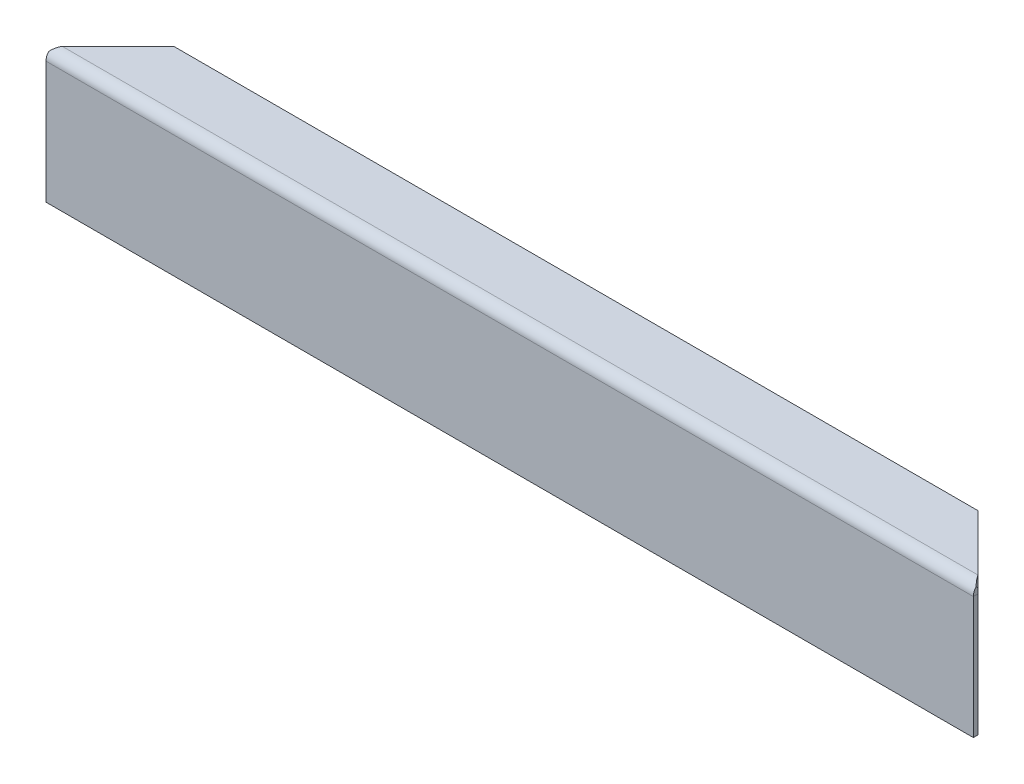
ISO-10303-21;
HEADER;
FILE_DESCRIPTION(('STEP AP214'),'2;1');
FILE_NAME('part.step','',(''),(''),'','','');
FILE_SCHEMA(('AUTOMOTIVE_DESIGN { 1 0 10303 214 1 1 1 1 }'));
ENDSEC;
DATA;
#1=APPLICATION_CONTEXT('core data for automotive mechanical design processes');
#2=APPLICATION_PROTOCOL_DEFINITION('international standard','automotive_design',2000,#1);
#3=PRODUCT_CONTEXT('',#1,'mechanical');
#4=PRODUCT('Part','Part','',(#3));
#5=PRODUCT_RELATED_PRODUCT_CATEGORY('part','',(#4));
#6=PRODUCT_DEFINITION_FORMATION('','',#4);
#7=PRODUCT_DEFINITION_CONTEXT('part definition',#1,'design');
#8=PRODUCT_DEFINITION('design','',#6,#7);
#9=PRODUCT_DEFINITION_SHAPE('','',#8);
#10=(LENGTH_UNIT() NAMED_UNIT(*) SI_UNIT(.MILLI.,.METRE.));
#11=(NAMED_UNIT(*) PLANE_ANGLE_UNIT() SI_UNIT($,.RADIAN.));
#12=(NAMED_UNIT(*) SI_UNIT($,.STERADIAN.) SOLID_ANGLE_UNIT());
#13=UNCERTAINTY_MEASURE_WITH_UNIT(LENGTH_MEASURE(1.E-05),#10,'distance_accuracy_value','');
#14=(GEOMETRIC_REPRESENTATION_CONTEXT(3) GLOBAL_UNCERTAINTY_ASSIGNED_CONTEXT((#13)) GLOBAL_UNIT_ASSIGNED_CONTEXT((#10,
#11,#12)) REPRESENTATION_CONTEXT('',''));
#15=CARTESIAN_POINT('',(0.,0.,0.));
#16=DIRECTION('',(0.,0.,1.));
#17=DIRECTION('',(1.,0.,0.));
#18=AXIS2_PLACEMENT_3D('',#15,#16,#17);
#19=CARTESIAN_POINT('',(177.6095,0.,-2.286));
#20=DIRECTION('',(0.,-1.,0.));
#21=DIRECTION('',(1.,0.,0.));
#22=AXIS2_PLACEMENT_3D('',#19,#20,#21);
#23=PLANE('',#22);
#24=DIRECTION('',(0.,0.,1.));
#25=VECTOR('',#24,1.);
#26=CARTESIAN_POINT('',(-177.6095,0.,-2.286));
#27=LINE('',#26,#25);
#28=CARTESIAN_POINT('',(-177.6095,0.,-1.78807183150061));
#29=VERTEX_POINT('',#28);
#30=CARTESIAN_POINT('',(-177.6095,0.,0.));
#31=VERTEX_POINT('',#30);
#32=EDGE_CURVE('E205',#29,#31,#27,.T.);
#33=ORIENTED_EDGE('',*,*,#32,.F.);
#34=DIRECTION('',(0.707106781186547,0.,-0.707106781186548));
#35=VECTOR('',#34,1.);
#36=CARTESIAN_POINT('',(-194.774098451333,0.,15.3765266198318));
#37=LINE('',#36,#35);
#38=CARTESIAN_POINT('',(-177.111571831501,0.,-2.286));
#39=VERTEX_POINT('',#38);
#40=EDGE_CURVE('E193',#29,#39,#37,.T.);
#41=ORIENTED_EDGE('',*,*,#40,.T.);
#42=DIRECTION('',(1.,0.,0.));
#43=VECTOR('',#42,1.);
#44=CARTESIAN_POINT('',(177.6095,0.,-2.286));
#45=LINE('',#44,#43);
#46=CARTESIAN_POINT('',(177.111571831501,0.,-2.28599999999999));
#47=VERTEX_POINT('',#46);
#48=EDGE_CURVE('E235',#39,#47,#45,.T.);
#49=ORIENTED_EDGE('',*,*,#48,.T.);
#50=DIRECTION('',(0.707106781186547,0.,0.707106781186548));
#51=VECTOR('',#50,1.);
#52=CARTESIAN_POINT('',(194.774098451333,0.,15.3765266198318));
#53=LINE('',#52,#51);
#54=CARTESIAN_POINT('',(177.6095,0.,-1.78807183150066));
#55=VERTEX_POINT('',#54);
#56=EDGE_CURVE('E542',#47,#55,#53,.T.);
#57=ORIENTED_EDGE('',*,*,#56,.T.);
#58=DIRECTION('',(0.,0.,1.));
#59=VECTOR('',#58,1.);
#60=CARTESIAN_POINT('',(177.6095,0.,-2.286));
#61=LINE('',#60,#59);
#62=CARTESIAN_POINT('',(177.6095,0.,0.));
#63=VERTEX_POINT('',#62);
#64=EDGE_CURVE('E233',#55,#63,#61,.T.);
#65=ORIENTED_EDGE('',*,*,#64,.T.);
#66=DIRECTION('',(1.,0.,0.));
#67=VECTOR('',#66,1.);
#68=CARTESIAN_POINT('',(177.6095,0.,0.));
#69=LINE('',#68,#67);
#70=EDGE_CURVE('E212',#31,#63,#69,.T.);
#71=ORIENTED_EDGE('',*,*,#70,.F.);
#72=EDGE_LOOP('',(#33,#41,#49,#57,#65,#71));
#73=FACE_BOUND('',#72,.T.);
#74=ADVANCED_FACE('F95',(#73),#23,.T.);
#75=CARTESIAN_POINT('',(-177.6095,72.4408,-2.286));
#76=DIRECTION('',(0.,0.,-1.));
#77=DIRECTION('',(-1.,0.,0.));
#78=AXIS2_PLACEMENT_3D('',#75,#76,#77);
#79=PLANE('',#78);
#80=ORIENTED_EDGE('',*,*,#48,.F.);
#81=DIRECTION('',(0.,1.,0.));
#82=VECTOR('',#81,1.);
#83=CARTESIAN_POINT('',(-177.111571831501,72.4408,-2.286));
#84=LINE('',#83,#82);
#85=CARTESIAN_POINT('',(-177.111571831501,46.7868,-2.286));
#86=VERTEX_POINT('',#85);
#87=EDGE_CURVE('E195',#39,#86,#84,.T.);
#88=ORIENTED_EDGE('',*,*,#87,.T.);
#89=DIRECTION('',(1.,0.,0.));
#90=VECTOR('',#89,1.);
#91=CARTESIAN_POINT('',(-177.6095,46.7868,-2.286));
#92=LINE('',#91,#90);
#93=CARTESIAN_POINT('',(177.111571831501,46.7868000000001,-2.286));
#94=VERTEX_POINT('',#93);
#95=EDGE_CURVE('E121',#86,#94,#92,.T.);
#96=ORIENTED_EDGE('',*,*,#95,.T.);
#97=DIRECTION('',(0.,-1.,0.));
#98=VECTOR('',#97,1.);
#99=CARTESIAN_POINT('',(177.111571831501,72.4408,-2.286));
#100=LINE('',#99,#98);
#101=EDGE_CURVE('E501',#94,#47,#100,.T.);
#102=ORIENTED_EDGE('',*,*,#101,.T.);
#103=EDGE_LOOP('',(#80,#88,#96,#102));
#104=FACE_BOUND('',#103,.T.);
#105=ADVANCED_FACE('F325',(#104),#79,.T.);
#106=CARTESIAN_POINT('',(-355.252296302746,46.7868,-4.0132));
#107=DIRECTION('',(1.,0.,0.));
#108=DIRECTION('',(0.,1.,0.));
#109=AXIS2_PLACEMENT_3D('',#106,#107,#108);
#110=CYLINDRICAL_SURFACE('',#109,1.7272);
#111=ORIENTED_EDGE('',*,*,#95,.F.);
#112=CARTESIAN_POINT('',(-175.384371831501,46.7868,-4.0132));
#113=DIRECTION('',(-0.707106781186548,0.,-0.707106781186547));
#114=DIRECTION('',(0.707106781186547,0.,-0.707106781186548));
#115=AXIS2_PLACEMENT_3D('',#112,#113,#114);
#116=ELLIPSE('',#115,2.44262966493081,1.7272);
#117=CARTESIAN_POINT('',(-175.446012764233,48.5128868917009,-3.95155907337018));
#118=VERTEX_POINT('',#117);
#119=EDGE_CURVE('E208',#86,#118,#116,.T.);
#120=ORIENTED_EDGE('',*,*,#119,.T.);
#121=CARTESIAN_POINT('',(-175.348450807017,48.514,-4.0132));
#122=CARTESIAN_POINT('',(-175.725316188597,48.514,-3.77503228673373));
#123=CARTESIAN_POINT('',(-176.102133871345,48.464053585038,-3.53700998334563));
#124=CARTESIAN_POINT('',(-176.855816935673,48.2726002821624,-3.10087656940627));
#125=CARTESIAN_POINT('',(-177.23263461842,48.131197152158,-2.90300182088417));
#126=CARTESIAN_POINT('',(-177.6095,47.955880039026,-2.74179459559466));
#127=B_SPLINE_CURVE_WITH_KNOTS('',3,(#121,#122,#123,#124,#125,#126),.UNSPECIFIED.,.F.,.F.,(4,2,
4),(0.,0.5,1.),.UNSPECIFIED.);
#128=CARTESIAN_POINT('',(-175.348450807017,48.514,-4.01320000000001));
#129=VERTEX_POINT('',#128);
#130=EDGE_CURVE('E364',#118,#129,#127,.F.);
#131=ORIENTED_EDGE('',*,*,#130,.T.);
#132=DIRECTION('',(1.,0.,0.));
#133=VECTOR('',#132,1.);
#134=CARTESIAN_POINT('',(-177.6095,48.514,-4.01320000000001));
#135=LINE('',#134,#133);
#136=CARTESIAN_POINT('',(175.348450807017,48.5140000000001,-4.01320000000001));
#137=VERTEX_POINT('',#136);
#138=EDGE_CURVE('E251',#129,#137,#135,.T.);
#139=ORIENTED_EDGE('',*,*,#138,.T.);
#140=CARTESIAN_POINT('',(177.6095,47.955880039026,-2.74179459559465));
#141=CARTESIAN_POINT('',(177.23263461842,48.131197152158,-2.90300182088419));
#142=CARTESIAN_POINT('',(176.855816935673,48.2726002821624,-3.10087656940626));
#143=CARTESIAN_POINT('',(176.102133871345,48.4640535850381,-3.53700998334563));
#144=CARTESIAN_POINT('',(175.725316188597,48.5140000000001,-3.77503228673376));
#145=CARTESIAN_POINT('',(175.348450807017,48.5140000000001,-4.0132));
#146=B_SPLINE_CURVE_WITH_KNOTS('',3,(#140,#141,#142,#143,#144,#145),.UNSPECIFIED.,.F.,.F.,(4,2,
4),(0.,0.5,1.),.UNSPECIFIED.);
#147=CARTESIAN_POINT('',(175.446018813949,48.5128995016381,-3.95155301755254));
#148=VERTEX_POINT('',#147);
#149=EDGE_CURVE('E361',#137,#148,#146,.F.);
#150=ORIENTED_EDGE('',*,*,#149,.T.);
#151=CARTESIAN_POINT('',(175.384371831501,46.7868000000001,-4.0132));
#152=DIRECTION('',(0.707106781186548,0.,-0.707106781186547));
#153=DIRECTION('',(0.707106781186547,0.,0.707106781186548));
#154=AXIS2_PLACEMENT_3D('',#151,#152,#153);
#155=ELLIPSE('',#154,2.44262966493081,1.7272);
#156=EDGE_CURVE('E106',#148,#94,#155,.T.);
#157=ORIENTED_EDGE('',*,*,#156,.T.);
#158=EDGE_LOOP('',(#111,#120,#131,#139,#150,#157));
#159=FACE_BOUND('',#158,.T.);
#160=ADVANCED_FACE('F330',(#159),#110,.F.);
#161=CARTESIAN_POINT('',(-177.6095,0.,-2.286));
#162=DIRECTION('',(-1.,0.,0.));
#163=DIRECTION('',(0.,0.,1.));
#164=AXIS2_PLACEMENT_3D('',#161,#162,#163);
#165=PLANE('',#164);
#166=DIRECTION('',(0.,0.,-1.));
#167=VECTOR('',#166,1.);
#168=CARTESIAN_POINT('',(-177.6095,46.7868,-2.28599999999967));
#169=LINE('',#168,#167);
#170=CARTESIAN_POINT('',(-177.6095,46.7868,0.));
#171=VERTEX_POINT('',#170);
#172=CARTESIAN_POINT('',(-177.6095,46.7868,-1.78807183150061));
#173=VERTEX_POINT('',#172);
#174=EDGE_CURVE('E207',#171,#173,#169,.T.);
#175=ORIENTED_EDGE('',*,*,#174,.T.);
#176=DIRECTION('',(0.,-1.,0.));
#177=VECTOR('',#176,1.);
#178=CARTESIAN_POINT('',(-177.6095,0.,-1.78807183150061));
#179=LINE('',#178,#177);
#180=EDGE_CURVE('E114',#173,#29,#179,.T.);
#181=ORIENTED_EDGE('',*,*,#180,.T.);
#182=ORIENTED_EDGE('',*,*,#32,.T.);
#183=DIRECTION('',(0.,-1.,0.));
#184=VECTOR('',#183,1.);
#185=CARTESIAN_POINT('',(-177.6095,0.,0.));
#186=LINE('',#185,#184);
#187=EDGE_CURVE('E228',#171,#31,#186,.T.);
#188=ORIENTED_EDGE('',*,*,#187,.F.);
#189=EDGE_LOOP('',(#175,#181,#182,#188));
#190=FACE_BOUND('',#189,.T.);
#191=ADVANCED_FACE('F203',(#190),#165,.T.);
#192=CARTESIAN_POINT('',(-177.6095,49.5031918553838,-1.05905214858759));
#193=CARTESIAN_POINT('',(-177.232601379573,49.9105822520617,-1.43365491431184));
#194=CARTESIAN_POINT('',(-176.855816935673,50.2391006556126,-1.89338967597338));
#195=CARTESIAN_POINT('',(-176.102133871345,50.6839480358236,-2.90675849071485));
#196=CARTESIAN_POINT('',(-175.725349427444,50.8,-3.45976150531997));
#197=CARTESIAN_POINT('',(-175.348450807017,50.8,-4.0132));
#198=CARTESIAN_POINT('',(-177.6095,47.955880039026,-2.74179459559466));
#199=CARTESIAN_POINT('',(-177.23263461842,48.131197152158,-2.90300182088417));
#200=CARTESIAN_POINT('',(-176.855816935673,48.2726002821624,-3.10087656940627));
#201=CARTESIAN_POINT('',(-176.102133871345,48.464053585038,-3.53700998334563));
#202=CARTESIAN_POINT('',(-175.725316188597,48.514,-3.77503228673373));
#203=CARTESIAN_POINT('',(-175.348450807017,48.514,-4.0132));
#204=B_SPLINE_SURFACE_WITH_KNOTS('',1,3,((#192,#193,#194,#195,#196,#197),(#198,#199,#200,#201,
#202,#203)),.UNSPECIFIED.,.F.,.F.,.F.,(2,2),(4,2,4),(0.,1.),(0.,0.5,1.),.UNSPECIFIED.);
#205=CARTESIAN_POINT('',(-175.446012764233,48.5128868917009,-3.95155907337018));
#206=CARTESIAN_POINT('',(-175.449206882686,48.5455880035259,-3.94836495101328));
#207=CARTESIAN_POINT('',(-175.452675186142,48.5782500494897,-3.94489664594991));
#208=CARTESIAN_POINT('',(-175.460454205558,48.6435102163485,-3.93711762534961));
#209=CARTESIAN_POINT('',(-175.46476836719,48.6761075055604,-3.93280346414966));
#210=CARTESIAN_POINT('',(-175.474687100062,48.7421492545261,-3.92288473160637));
#211=CARTESIAN_POINT('',(-175.480332638169,48.7755818078083,-3.9172391933771));
#212=CARTESIAN_POINT('',(-175.49330947285,48.8417461048384,-3.90426235860662));
#213=CARTESIAN_POINT('',(-175.500637764135,48.8744789855791,-3.8969340673548));
#214=CARTESIAN_POINT('',(-175.517282849814,48.9371616920821,-3.88028898169822));
#215=CARTESIAN_POINT('',(-175.526486312869,48.9671695502537,-3.8710855186347));
#216=CARTESIAN_POINT('',(-175.547739798319,49.024865027499,-3.84983203317874));
#217=CARTESIAN_POINT('',(-175.559765779153,49.0525697041386,-3.83780605234716));
#218=CARTESIAN_POINT('',(-175.5875100501,49.1049043584101,-3.81006178140149));
#219=CARTESIAN_POINT('',(-175.603291835616,49.1294688494546,-3.79427999588556));
#220=CARTESIAN_POINT('',(-175.638122243713,49.1734406624044,-3.75944958778767));
#221=CARTESIAN_POINT('',(-175.657172897421,49.1928447586461,-3.74039893408051));
#222=CARTESIAN_POINT('',(-175.700179239359,49.2286355743076,-3.69739259214289));
#223=CARTESIAN_POINT('',(-175.724449379751,49.2442453598221,-3.67312245174995));
#224=CARTESIAN_POINT('',(-175.774425789598,49.2700849065252,-3.62314604190272));
#225=CARTESIAN_POINT('',(-175.800138409339,49.2802884101491,-3.59743342216158));
#226=CARTESIAN_POINT('',(-175.862592765645,49.3001200780426,-3.53497906585613));
#227=CARTESIAN_POINT('',(-175.899617500327,49.30787217867,-3.49795433117369));
#228=CARTESIAN_POINT('',(-175.974037897504,49.3185311208167,-3.42353393399651));
#229=CARTESIAN_POINT('',(-176.011434226305,49.3214265555919,-3.38613760519589));
#230=CARTESIAN_POINT('',(-176.086426325656,49.3238315016096,-3.31114550584512));
#231=CARTESIAN_POINT('',(-176.124022279787,49.3233269100508,-3.27354955171399));
#232=CARTESIAN_POINT('',(-176.199103565233,49.3197398667272,-3.19846826626811));
#233=CARTESIAN_POINT('',(-176.236588971313,49.3166601272755,-3.16098286018764));
#234=CARTESIAN_POINT('',(-176.330837909036,49.3062917768675,-3.06673392246498));
#235=CARTESIAN_POINT('',(-176.387526898702,49.2976492147959,-3.01004493279909));
#236=CARTESIAN_POINT('',(-176.500560545259,49.2765382895708,-2.89701128624202));
#237=CARTESIAN_POINT('',(-176.556905016692,49.2640680240594,-2.84066681480916));
#238=CARTESIAN_POINT('',(-176.724865555491,49.2218358075386,-2.67270627600993));
#239=CARTESIAN_POINT('',(-176.835883936843,49.1871894798894,-2.56168789465781));
#240=CARTESIAN_POINT('',(-177.002301333068,49.1263950270929,-2.39527049843304));
#241=CARTESIAN_POINT('',(-177.058476383188,49.1043159235778,-2.33909544831347));
#242=CARTESIAN_POINT('',(-177.170249857304,49.0573639482181,-2.22732197419702));
#243=CARTESIAN_POINT('',(-177.225848233999,49.0324908491451,-2.17172359750171));
#244=CARTESIAN_POINT('',(-177.336534351116,48.9800097175701,-2.06103748038543));
#245=CARTESIAN_POINT('',(-177.391620641565,48.9523955900521,-2.00595118993566));
#246=CARTESIAN_POINT('',(-177.501094645992,48.8945587535436,-1.8964771855087));
#247=CARTESIAN_POINT('',(-177.555482467129,48.864336450327,-1.8420893643724));
#248=CARTESIAN_POINT('',(-177.6095,48.8328452008883,-1.78807183150059));
#249=B_SPLINE_CURVE_WITH_KNOTS('',3,(#205,#206,#207,#208,#209,#210,#211,#212,#213,#214,#215,
#216,#217,#218,#219,#220,#221,#222,#223,#224,#225,#226,#227,#228,#229,#230,#231,#232,#233,#234,
#235,#236,#237,#238,#239,#240,#241,#242,#243,#244,#245,#246,#247,#248),.UNSPECIFIED.,.F.,.F.,(4,
2,2,2,2,2,2,2,2,2,2,2,2,2,2,2,2,2,2,2,2,4),(0.,0.0990542618337303,0.198520742388129,
0.301578505261612,0.404453625687403,0.502352609547092,0.599446178649195,0.698315172553958,
0.797245823074888,0.909722348036202,1.02274026130295,1.18113792319745,1.33990709193491,
1.49933521566717,1.65859563055117,1.90037229225202,2.14226931137541,2.62404486676892,
2.87137497437085,3.11872521126021,3.36663833750008,3.61451296327648),.UNSPECIFIED.);
#250=CARTESIAN_POINT('',(-177.6095,48.8328452008883,-1.78807183150061));
#251=VERTEX_POINT('',#250);
#252=EDGE_CURVE('E199',#118,#251,#249,.T.);
#253=CARTESIAN_POINT('',(-177.6095,47.955880039026,-2.74179459559466));
#254=CARTESIAN_POINT('',(-177.6095,49.5031918553838,-1.05905214858759));
#255=B_SPLINE_CURVE_WITH_KNOTS('',1,(#253,#254),.UNSPECIFIED.,.F.,.F.,(2,2),(0.,1.),.UNSPECIFIED.);
#256=CARTESIAN_POINT('',(-177.6095,49.5031918553838,-1.05905214858759));
#257=VERTEX_POINT('',#256);
#258=EDGE_CURVE('E240',#257,#251,#255,.F.);
#259=CARTESIAN_POINT('',(-177.6095,49.5031918553838,-1.05905214858759));
#260=CARTESIAN_POINT('',(-177.232601379573,49.9105822520617,-1.43365491431184));
#261=CARTESIAN_POINT('',(-176.855816935673,50.2391006556126,-1.89338967597338));
#262=CARTESIAN_POINT('',(-176.102133871345,50.6839480358236,-2.90675849071485));
#263=CARTESIAN_POINT('',(-175.725349427444,50.8,-3.45976150531997));
#264=CARTESIAN_POINT('',(-175.348450807017,50.8,-4.0132));
#265=B_SPLINE_CURVE_WITH_KNOTS('',3,(#259,#260,#261,#262,#263,#264),.UNSPECIFIED.,.F.,.F.,(4,2,
4),(0.,0.5,1.),.UNSPECIFIED.);
#266=CARTESIAN_POINT('',(-175.348450807017,50.8,-4.01320000000001));
#267=VERTEX_POINT('',#266);
#268=EDGE_CURVE('E451',#257,#267,#265,.T.);
#269=CARTESIAN_POINT('',(-175.348450807017,50.8,-4.0132));
#270=CARTESIAN_POINT('',(-175.348450807017,48.514,-4.0132));
#271=B_SPLINE_CURVE_WITH_KNOTS('',1,(#269,#270),.UNSPECIFIED.,.F.,.F.,(2,2),(0.,1.),.UNSPECIFIED.);
#272=EDGE_CURVE('E272',#267,#129,#271,.T.);
#273=ORIENTED_EDGE('',*,*,#130,.F.);
#274=ORIENTED_EDGE('',*,*,#252,.T.);
#275=ORIENTED_EDGE('',*,*,#258,.F.);
#276=ORIENTED_EDGE('',*,*,#268,.T.);
#277=ORIENTED_EDGE('',*,*,#272,.T.);
#278=EDGE_LOOP('',(#273,#274,#275,#276,#277));
#279=FACE_BOUND('',#278,.T.);
#280=ADVANCED_FACE('F346',(#279),#204,.F.);
#281=CARTESIAN_POINT('',(-177.6095,46.7868,-4.0132));
#282=DIRECTION('',(1.,0.,0.));
#283=DIRECTION('',(0.,0.,-1.));
#284=AXIS2_PLACEMENT_3D('',#281,#282,#283);
#285=PLANE('',#284);
#286=ORIENTED_EDGE('',*,*,#258,.T.);
#287=DIRECTION('',(0.,1.,0.));
#288=VECTOR('',#287,1.);
#289=CARTESIAN_POINT('',(-177.6095,46.7868,-1.78807183150061));
#290=LINE('',#289,#288);
#291=EDGE_CURVE('E12',#251,#173,#290,.F.);
#292=ORIENTED_EDGE('',*,*,#291,.T.);
#293=ORIENTED_EDGE('',*,*,#174,.F.);
#294=CARTESIAN_POINT('',(-177.6095,46.7868,-4.0132));
#295=DIRECTION('',(1.,0.,0.));
#296=DIRECTION('',(0.,1.,0.));
#297=AXIS2_PLACEMENT_3D('',#294,#295,#296);
#298=CIRCLE('',#297,4.0132);
#299=EDGE_CURVE('E456',#171,#257,#298,.F.);
#300=ORIENTED_EDGE('',*,*,#299,.T.);
#301=EDGE_LOOP('',(#286,#292,#293,#300));
#302=FACE_BOUND('',#301,.T.);
#303=ADVANCED_FACE('F333',(#302),#285,.F.);
#304=CARTESIAN_POINT('',(177.6095,0.,-2.286));
#305=DIRECTION('',(1.,0.,0.));
#306=DIRECTION('',(0.,0.,-1.));
#307=AXIS2_PLACEMENT_3D('',#304,#305,#306);
#308=PLANE('',#307);
#309=ORIENTED_EDGE('',*,*,#64,.F.);
#310=DIRECTION('',(0.,1.,0.));
#311=VECTOR('',#310,1.);
#312=CARTESIAN_POINT('',(177.6095,0.,-1.78807183150066));
#313=LINE('',#312,#311);
#314=CARTESIAN_POINT('',(177.6095,46.7868,-1.78807183150066));
#315=VERTEX_POINT('',#314);
#316=EDGE_CURVE('E459',#55,#315,#313,.T.);
#317=ORIENTED_EDGE('',*,*,#316,.T.);
#318=DIRECTION('',(0.,0.,1.));
#319=VECTOR('',#318,1.);
#320=CARTESIAN_POINT('',(177.6095,46.7868,-2.28599999999967));
#321=LINE('',#320,#319);
#322=CARTESIAN_POINT('',(177.6095,46.7868,0.));
#323=VERTEX_POINT('',#322);
#324=EDGE_CURVE('E230',#315,#323,#321,.T.);
#325=ORIENTED_EDGE('',*,*,#324,.T.);
#326=DIRECTION('',(0.,1.,0.));
#327=VECTOR('',#326,1.);
#328=CARTESIAN_POINT('',(177.6095,0.,0.));
#329=LINE('',#328,#327);
#330=EDGE_CURVE('E217',#63,#323,#329,.T.);
#331=ORIENTED_EDGE('',*,*,#330,.F.);
#332=EDGE_LOOP('',(#309,#317,#325,#331));
#333=FACE_BOUND('',#332,.T.);
#334=ADVANCED_FACE('F336',(#333),#308,.T.);
#335=CARTESIAN_POINT('',(175.348450807017,50.8000000000001,-4.0132));
#336=CARTESIAN_POINT('',(175.725349427444,50.8000000000001,-3.45976150532001));
#337=CARTESIAN_POINT('',(176.102133871345,50.6839480358236,-2.90675849071485));
#338=CARTESIAN_POINT('',(176.855816935673,50.2391006556126,-1.89338967597337));
#339=CARTESIAN_POINT('',(177.232601379573,49.9105822520618,-1.43365491431185));
#340=CARTESIAN_POINT('',(177.6095,49.5031918553838,-1.05905214858757));
#341=CARTESIAN_POINT('',(175.348450807017,48.5140000000001,-4.0132));
#342=CARTESIAN_POINT('',(175.725316188597,48.5140000000001,-3.77503228673376));
#343=CARTESIAN_POINT('',(176.102133871345,48.4640535850381,-3.53700998334563));
#344=CARTESIAN_POINT('',(176.855816935673,48.2726002821624,-3.10087656940626));
#345=CARTESIAN_POINT('',(177.23263461842,48.131197152158,-2.90300182088419));
#346=CARTESIAN_POINT('',(177.6095,47.955880039026,-2.74179459559465));
#347=B_SPLINE_SURFACE_WITH_KNOTS('',1,3,((#335,#336,#337,#338,#339,#340),(#341,#342,#343,#344,
#345,#346)),.UNSPECIFIED.,.F.,.F.,.F.,(2,2),(4,2,4),(0.,1.),(0.,0.5,1.),.UNSPECIFIED.);
#348=CARTESIAN_POINT('',(177.6095,49.5031918553838,-1.05905214858757));
#349=CARTESIAN_POINT('',(177.6095,47.955880039026,-2.74179459559465));
#350=B_SPLINE_CURVE_WITH_KNOTS('',1,(#348,#349),.UNSPECIFIED.,.F.,.F.,(2,2),(0.,1.),.UNSPECIFIED.);
#351=CARTESIAN_POINT('',(177.6095,49.5031918553838,-1.05905214858758));
#352=VERTEX_POINT('',#351);
#353=CARTESIAN_POINT('',(177.6095,48.8328452008883,-1.78807183150066));
#354=VERTEX_POINT('',#353);
#355=EDGE_CURVE('E374',#352,#354,#350,.T.);
#356=CARTESIAN_POINT('',(177.6095,48.8328452008883,-1.78807183150066));
#357=CARTESIAN_POINT('',(177.567605282298,48.8572705136777,-1.8299665492029));
#358=CARTESIAN_POINT('',(177.525487285533,48.8809311753819,-1.87208454596823));
#359=CARTESIAN_POINT('',(177.440814933037,48.9266984142547,-1.95675689846373));
#360=CARTESIAN_POINT('',(177.39826043453,48.9488044630548,-1.99931139697142));
#361=CARTESIAN_POINT('',(177.312747640942,48.9914241220997,-2.08482419055896));
#362=CARTESIAN_POINT('',(177.269789289929,49.0119375080057,-2.12778254157256));
#363=CARTESIAN_POINT('',(177.183131387631,49.051492677209,-2.21444044387037));
#364=CARTESIAN_POINT('',(177.139428639844,49.0705204627987,-2.25814319165728));
#365=CARTESIAN_POINT('',(177.051670935545,49.1068510796233,-2.34590089595561));
#366=CARTESIAN_POINT('',(177.007616019475,49.1241541059307,-2.38995581202614));
#367=CARTESIAN_POINT('',(176.919179839205,49.156961891074,-2.47839199229569));
#368=CARTESIAN_POINT('',(176.874798623986,49.1724669141684,-2.52277320751524));
#369=CARTESIAN_POINT('',(176.770128146026,49.2066854871057,-2.62744368547478));
#370=CARTESIAN_POINT('',(176.709710312735,49.2246213715465,-2.6878615187664));
#371=CARTESIAN_POINT('',(176.588348514761,49.2567169218008,-2.80922331674029));
#372=CARTESIAN_POINT('',(176.527404348267,49.2708750661145,-2.87016748323437));
#373=CARTESIAN_POINT('',(176.405190668335,49.2947995168719,-2.99238116316629));
#374=CARTESIAN_POINT('',(176.343922009429,49.3045742437433,-3.05364982207188));
#375=CARTESIAN_POINT('',(176.251804934305,49.315097629961,-3.14576689719654));
#376=CARTESIAN_POINT('',(176.221074688428,49.3179153702354,-3.17649714307329));
#377=CARTESIAN_POINT('',(176.15956265487,49.3219075056843,-3.23800917663088));
#378=CARTESIAN_POINT('',(176.128780868069,49.323081928637,-3.26879096343168));
#379=CARTESIAN_POINT('',(176.053583894603,49.3235143425024,-3.34398793689811));
#380=CARTESIAN_POINT('',(176.009153848224,49.3216963855774,-3.3884179832769));
#381=CARTESIAN_POINT('',(175.942780708344,49.314302300324,-3.45479112315744));
#382=CARTESIAN_POINT('',(175.920710085407,49.3110618891175,-3.47686174609448));
#383=CARTESIAN_POINT('',(175.8767681871,49.3025656432974,-3.52080364440155));
#384=CARTESIAN_POINT('',(175.85489680456,49.2973109667865,-3.54267502694103));
#385=CARTESIAN_POINT('',(175.809149079648,49.2834457041351,-3.58842275185297));
#386=CARTESIAN_POINT('',(175.78531679217,49.2745295834271,-3.61225503933083));
#387=CARTESIAN_POINT('',(175.738696823895,49.2522818669006,-3.65887500760587));
#388=CARTESIAN_POINT('',(175.715907146684,49.2389591495578,-3.68166468481662));
#389=CARTESIAN_POINT('',(175.676334293455,49.2096184935868,-3.72123753804651));
#390=CARTESIAN_POINT('',(175.659213008555,49.194533009698,-3.73835882294634));
#391=CARTESIAN_POINT('',(175.627099829605,49.160395964163,-3.77047200189639));
#392=CARTESIAN_POINT('',(175.612104080609,49.1413517411159,-3.78546775089211));
#393=CARTESIAN_POINT('',(175.58473898296,49.0999120830224,-3.81283284854078));
#394=CARTESIAN_POINT('',(175.572363869458,49.0775241924575,-3.82520796204314));
#395=CARTESIAN_POINT('',(175.550112901455,49.0303572653056,-3.84745893004636));
#396=CARTESIAN_POINT('',(175.540243804281,49.0055720074269,-3.85732802722023));
#397=CARTESIAN_POINT('',(175.520514354606,48.9485259352922,-3.87705747689519));
#398=CARTESIAN_POINT('',(175.511213248234,48.9158881688436,-3.88635858326684));
#399=CARTESIAN_POINT('',(175.49490549826,48.8494618981049,-3.90266633324095));
#400=CARTESIAN_POINT('',(175.487903860541,48.8156710577071,-3.90966797095988));
#401=CARTESIAN_POINT('',(175.475490853369,48.7473855027995,-3.92208097813198));
#402=CARTESIAN_POINT('',(175.470085863179,48.7128885382739,-3.92748596832137));
#403=CARTESIAN_POINT('',(175.460427082882,48.6436128113205,-3.93714474861999));
#404=CARTESIAN_POINT('',(175.456172324487,48.6088343114597,-3.94139950701676));
#405=CARTESIAN_POINT('',(175.451209828261,48.5637846439029,-3.94636200324146));
#406=CARTESIAN_POINT('',(175.450123360293,48.553593530081,-3.94744847120801));
#407=CARTESIAN_POINT('',(175.448019122138,48.533232534773,-3.94955270936256));
#408=CARTESIAN_POINT('',(175.447001130756,48.5230626990484,-3.95057070074463));
#409=CARTESIAN_POINT('',(175.446012734657,48.5128868975456,-3.95155909684375));
#410=B_SPLINE_CURVE_WITH_KNOTS('',3,(#356,#357,#358,#359,#360,#361,#362,#363,#364,#365,#366,
#367,#368,#369,#370,#371,#372,#373,#374,#375,#376,#377,#378,#379,#380,#381,#382,#383,#384,#385,
#386,#387,#388,#389,#390,#391,#392,#393,#394,#395,#396,#397,#398,#399,#400,#401,#402,#403,#404,
#405,#406,#407,#408,#409),.UNSPECIFIED.,.F.,.F.,(4,2,2,2,2,2,2,2,2,2,2,2,2,2,2,2,2,2,2,2,2,2,2,
2,2,2,4),(0.,0.192251399211834,0.384567826496512,0.576911294053686,0.770890419993928,
0.964847581691431,1.15877620063864,1.42061240708208,1.68255391046922,1.94399005287507,
2.07461389206698,2.20523552319115,2.39356737333092,2.48766095575455,2.58170051998283,
2.68608298693397,2.79025641080545,2.87546167379454,2.9605103721865,3.04536999182624,
3.13045605712816,3.23575894733987,3.34128958265747,3.44723632397521,3.55309359755607,
3.58401233013942,3.61482584765634),.UNSPECIFIED.);
#411=EDGE_CURVE('E372',#354,#148,#410,.T.);
#412=CARTESIAN_POINT('',(175.348450807017,48.5140000000001,-4.0132));
#413=CARTESIAN_POINT('',(175.348450807017,50.8000000000001,-4.0132));
#414=B_SPLINE_CURVE_WITH_KNOTS('',1,(#412,#413),.UNSPECIFIED.,.F.,.F.,(2,2),(0.,1.),.UNSPECIFIED.);
#415=CARTESIAN_POINT('',(175.348450807017,50.8,-4.01320000000002));
#416=VERTEX_POINT('',#415);
#417=EDGE_CURVE('E260',#137,#416,#414,.T.);
#418=CARTESIAN_POINT('',(175.348450807017,50.8000000000001,-4.0132));
#419=CARTESIAN_POINT('',(175.725349427444,50.8000000000001,-3.45976150532001));
#420=CARTESIAN_POINT('',(176.102133871345,50.6839480358236,-2.90675849071485));
#421=CARTESIAN_POINT('',(176.855816935673,50.2391006556126,-1.89338967597337));
#422=CARTESIAN_POINT('',(177.232601379573,49.9105822520618,-1.43365491431185));
#423=CARTESIAN_POINT('',(177.6095,49.5031918553838,-1.05905214858757));
#424=B_SPLINE_CURVE_WITH_KNOTS('',3,(#418,#419,#420,#421,#422,#423),.UNSPECIFIED.,.F.,.F.,(4,2,
4),(0.,0.5,1.),.UNSPECIFIED.);
#425=EDGE_CURVE('E458',#416,#352,#424,.T.);
#426=ORIENTED_EDGE('',*,*,#355,.T.);
#427=ORIENTED_EDGE('',*,*,#411,.T.);
#428=ORIENTED_EDGE('',*,*,#149,.F.);
#429=ORIENTED_EDGE('',*,*,#417,.T.);
#430=ORIENTED_EDGE('',*,*,#425,.T.);
#431=EDGE_LOOP('',(#426,#427,#428,#429,#430));
#432=FACE_BOUND('',#431,.T.);
#433=ADVANCED_FACE('F321',(#432),#347,.F.);
#434=CARTESIAN_POINT('',(177.6095,46.7868000000001,-4.0132));
#435=DIRECTION('',(-1.,0.,0.));
#436=DIRECTION('',(0.,0.,1.));
#437=AXIS2_PLACEMENT_3D('',#434,#435,#436);
#438=PLANE('',#437);
#439=ORIENTED_EDGE('',*,*,#324,.F.);
#440=DIRECTION('',(0.,-1.,0.));
#441=VECTOR('',#440,1.);
#442=CARTESIAN_POINT('',(177.6095,46.7868000000001,-1.78807183150066));
#443=LINE('',#442,#441);
#444=EDGE_CURVE('E492',#315,#354,#443,.F.);
#445=ORIENTED_EDGE('',*,*,#444,.T.);
#446=ORIENTED_EDGE('',*,*,#355,.F.);
#447=CARTESIAN_POINT('',(177.6095,46.7868000000001,-4.0132));
#448=DIRECTION('',(1.,0.,0.));
#449=DIRECTION('',(0.,1.,0.));
#450=AXIS2_PLACEMENT_3D('',#447,#448,#449);
#451=CIRCLE('',#450,4.0132);
#452=EDGE_CURVE('E462',#352,#323,#451,.T.);
#453=ORIENTED_EDGE('',*,*,#452,.T.);
#454=EDGE_LOOP('',(#439,#445,#446,#453));
#455=FACE_BOUND('',#454,.T.);
#456=ADVANCED_FACE('F315',(#455),#438,.F.);
#457=CARTESIAN_POINT('',(-177.6095,50.7999999999999,-25.3741508070165));
#458=DIRECTION('',(0.,-1.,0.));
#459=DIRECTION('',(-1.,0.,0.));
#460=AXIS2_PLACEMENT_3D('',#457,#458,#459);
#461=PLANE('',#460);
#462=DIRECTION('',(-0.707106781186553,0.,0.707106781186542));
#463=VECTOR('',#462,1.);
#464=CARTESIAN_POINT('',(-177.6095,50.8,-1.7521508070164));
#465=LINE('',#464,#463);
#466=CARTESIAN_POINT('',(-153.9875,50.7999999999999,-25.3741508070164));
#467=VERTEX_POINT('',#466);
#468=EDGE_CURVE('E248',#467,#267,#465,.T.);
#469=ORIENTED_EDGE('',*,*,#468,.T.);
#470=DIRECTION('',(1.,0.,0.));
#471=VECTOR('',#470,1.);
#472=CARTESIAN_POINT('',(-177.6095,50.8,-4.0132));
#473=LINE('',#472,#471);
#474=EDGE_CURVE('E277',#267,#416,#473,.T.);
#475=ORIENTED_EDGE('',*,*,#474,.T.);
#476=DIRECTION('',(-0.707106781186553,0.,-0.707106781186542));
#477=VECTOR('',#476,1.);
#478=CARTESIAN_POINT('',(177.6095,50.8000000000001,-1.7521508070164));
#479=LINE('',#478,#477);
#480=CARTESIAN_POINT('',(153.9875,50.8,-25.3741508070165));
#481=VERTEX_POINT('',#480);
#482=EDGE_CURVE('E213',#416,#481,#479,.T.);
#483=ORIENTED_EDGE('',*,*,#482,.T.);
#484=DIRECTION('',(-1.,0.,0.));
#485=VECTOR('',#484,1.);
#486=CARTESIAN_POINT('',(-153.9875,50.7999999999999,-25.3741508070164));
#487=LINE('',#486,#485);
#488=EDGE_CURVE('E215',#481,#467,#487,.T.);
#489=ORIENTED_EDGE('',*,*,#488,.T.);
#490=EDGE_LOOP('',(#469,#475,#483,#489));
#491=FACE_BOUND('',#490,.T.);
#492=ADVANCED_FACE('F313',(#491),#461,.F.);
#493=CARTESIAN_POINT('',(-177.6095,48.514,-1.75215080701639));
#494=DIRECTION('',(-0.707106781186542,0.,-0.707106781186553));
#495=DIRECTION('',(-0.707106781186553,0.,0.707106781186542));
#496=AXIS2_PLACEMENT_3D('',#493,#494,#495);
#497=PLANE('',#496);
#498=ORIENTED_EDGE('',*,*,#272,.F.);
#499=ORIENTED_EDGE('',*,*,#468,.F.);
#500=DIRECTION('',(0.,1.,0.));
#501=VECTOR('',#500,1.);
#502=CARTESIAN_POINT('',(-153.9875,48.5139999999999,-25.3741508070164));
#503=LINE('',#502,#501);
#504=CARTESIAN_POINT('',(-153.9875,48.5139999999999,-25.3741508070164));
#505=VERTEX_POINT('',#504);
#506=EDGE_CURVE('E249',#505,#467,#503,.T.);
#507=ORIENTED_EDGE('',*,*,#506,.F.);
#508=DIRECTION('',(-0.707106781186553,0.,0.707106781186542));
#509=VECTOR('',#508,1.);
#510=CARTESIAN_POINT('',(-177.6095,48.514,-1.75215080701639));
#511=LINE('',#510,#509);
#512=EDGE_CURVE('E244',#505,#129,#511,.T.);
#513=ORIENTED_EDGE('',*,*,#512,.T.);
#514=EDGE_LOOP('',(#498,#499,#507,#513));
#515=FACE_BOUND('',#514,.T.);
#516=ADVANCED_FACE('F97',(#515),#497,.T.);
#517=CARTESIAN_POINT('',(-153.9875,48.5139999999999,-25.3741508070164));
#518=DIRECTION('',(0.,0.,-1.));
#519=DIRECTION('',(-1.,0.,0.));
#520=AXIS2_PLACEMENT_3D('',#517,#518,#519);
#521=PLANE('',#520);
#522=ORIENTED_EDGE('',*,*,#488,.F.);
#523=DIRECTION('',(0.,1.,0.));
#524=VECTOR('',#523,1.);
#525=CARTESIAN_POINT('',(153.9875,48.514,-25.3741508070164));
#526=LINE('',#525,#524);
#527=CARTESIAN_POINT('',(153.9875,48.514,-25.3741508070164));
#528=VERTEX_POINT('',#527);
#529=EDGE_CURVE('E252',#528,#481,#526,.T.);
#530=ORIENTED_EDGE('',*,*,#529,.F.);
#531=DIRECTION('',(-1.,0.,0.));
#532=VECTOR('',#531,1.);
#533=CARTESIAN_POINT('',(-153.9875,48.5139999999999,-25.3741508070164));
#534=LINE('',#533,#532);
#535=EDGE_CURVE('E241',#528,#505,#534,.T.);
#536=ORIENTED_EDGE('',*,*,#535,.T.);
#537=ORIENTED_EDGE('',*,*,#506,.T.);
#538=EDGE_LOOP('',(#522,#530,#536,#537));
#539=FACE_BOUND('',#538,.T.);
#540=ADVANCED_FACE('F311',(#539),#521,.T.);
#541=CARTESIAN_POINT('',(177.6095,48.5140000000001,-1.75215080701639));
#542=DIRECTION('',(0.707106781186542,0.,-0.707106781186553));
#543=DIRECTION('',(-0.707106781186553,0.,-0.707106781186542));
#544=AXIS2_PLACEMENT_3D('',#541,#542,#543);
#545=PLANE('',#544);
#546=ORIENTED_EDGE('',*,*,#417,.F.);
#547=DIRECTION('',(-0.707106781186553,0.,-0.707106781186542));
#548=VECTOR('',#547,1.);
#549=CARTESIAN_POINT('',(177.6095,48.5140000000001,-1.75215080701639));
#550=LINE('',#549,#548);
#551=EDGE_CURVE('E245',#137,#528,#550,.T.);
#552=ORIENTED_EDGE('',*,*,#551,.T.);
#553=ORIENTED_EDGE('',*,*,#529,.T.);
#554=ORIENTED_EDGE('',*,*,#482,.F.);
#555=EDGE_LOOP('',(#546,#552,#553,#554));
#556=FACE_BOUND('',#555,.T.);
#557=ADVANCED_FACE('F301',(#556),#545,.T.);
#558=CARTESIAN_POINT('',(-177.6095,48.5139999999999,-25.3741508070164));
#559=DIRECTION('',(0.,-1.,0.));
#560=DIRECTION('',(-1.,0.,0.));
#561=AXIS2_PLACEMENT_3D('',#558,#559,#560);
#562=PLANE('',#561);
#563=ORIENTED_EDGE('',*,*,#138,.F.);
#564=ORIENTED_EDGE('',*,*,#512,.F.);
#565=ORIENTED_EDGE('',*,*,#535,.F.);
#566=ORIENTED_EDGE('',*,*,#551,.F.);
#567=EDGE_LOOP('',(#563,#564,#565,#566));
#568=FACE_BOUND('',#567,.T.);
#569=ADVANCED_FACE('F310',(#568),#562,.T.);
#570=CARTESIAN_POINT('',(-177.6095,72.4408,0.));
#571=DIRECTION('',(0.,0.,-1.));
#572=DIRECTION('',(-1.,0.,0.));
#573=AXIS2_PLACEMENT_3D('',#570,#571,#572);
#574=PLANE('',#573);
#575=DIRECTION('',(1.,0.,0.));
#576=VECTOR('',#575,1.);
#577=CARTESIAN_POINT('',(-177.6095,46.7868,0.));
#578=LINE('',#577,#576);
#579=EDGE_CURVE('E237',#171,#323,#578,.T.);
#580=ORIENTED_EDGE('',*,*,#579,.F.);
#581=ORIENTED_EDGE('',*,*,#187,.T.);
#582=ORIENTED_EDGE('',*,*,#70,.T.);
#583=ORIENTED_EDGE('',*,*,#330,.T.);
#584=EDGE_LOOP('',(#580,#581,#582,#583));
#585=FACE_BOUND('',#584,.T.);
#586=ADVANCED_FACE('F340',(#585),#574,.F.);
#587=CARTESIAN_POINT('',(-355.252296302746,46.7868,-4.0132));
#588=DIRECTION('',(1.,0.,0.));
#589=DIRECTION('',(0.,1.,0.));
#590=AXIS2_PLACEMENT_3D('',#587,#588,#589);
#591=CYLINDRICAL_SURFACE('',#590,4.0132);
#592=ORIENTED_EDGE('',*,*,#579,.T.);
#593=ORIENTED_EDGE('',*,*,#452,.F.);
#594=ORIENTED_EDGE('',*,*,#425,.F.);
#595=ORIENTED_EDGE('',*,*,#474,.F.);
#596=ORIENTED_EDGE('',*,*,#268,.F.);
#597=ORIENTED_EDGE('',*,*,#299,.F.);
#598=EDGE_LOOP('',(#592,#593,#594,#595,#596,#597));
#599=FACE_BOUND('',#598,.T.);
#600=ADVANCED_FACE('F343',(#599),#591,.T.);
#601=CARTESIAN_POINT('',(194.774098451333,50.80574,15.3765266198318));
#602=DIRECTION('',(0.707106781186548,0.,-0.707106781186547));
#603=DIRECTION('',(-0.707106781186547,0.,-0.707106781186548));
#604=AXIS2_PLACEMENT_3D('',#601,#602,#603);
#605=PLANE('',#604);
#606=ORIENTED_EDGE('',*,*,#56,.F.);
#607=ORIENTED_EDGE('',*,*,#101,.F.);
#608=ORIENTED_EDGE('',*,*,#156,.F.);
#609=ORIENTED_EDGE('',*,*,#411,.F.);
#610=ORIENTED_EDGE('',*,*,#444,.F.);
#611=ORIENTED_EDGE('',*,*,#316,.F.);
#612=EDGE_LOOP('',(#606,#607,#608,#609,#610,#611));
#613=FACE_BOUND('',#612,.T.);
#614=ADVANCED_FACE('F519',(#613),#605,.T.);
#615=CARTESIAN_POINT('',(-194.774098451333,50.80574,15.3765266198318));
#616=DIRECTION('',(-0.707106781186548,0.,-0.707106781186547));
#617=DIRECTION('',(-0.707106781186547,0.,0.707106781186548));
#618=AXIS2_PLACEMENT_3D('',#615,#616,#617);
#619=PLANE('',#618);
#620=ORIENTED_EDGE('',*,*,#40,.F.);
#621=ORIENTED_EDGE('',*,*,#180,.F.);
#622=ORIENTED_EDGE('',*,*,#291,.F.);
#623=ORIENTED_EDGE('',*,*,#252,.F.);
#624=ORIENTED_EDGE('',*,*,#119,.F.);
#625=ORIENTED_EDGE('',*,*,#87,.F.);
#626=EDGE_LOOP('',(#620,#621,#622,#623,#624,#625));
#627=FACE_BOUND('',#626,.T.);
#628=ADVANCED_FACE('F194',(#627),#619,.T.);
#629=CLOSED_SHELL('',(#74,#105,#160,#191,#280,#303,#334,#433,#456,#492,#516,#540,#557,#569,#586,
#600,#614,#628));
#630=MANIFOLD_SOLID_BREP('B2',#629);
#631=ADVANCED_BREP_SHAPE_REPRESENTATION('',(#18,#630),#14);
#632=SHAPE_DEFINITION_REPRESENTATION(#9,#631);
ENDSEC;
END-ISO-10303-21;
